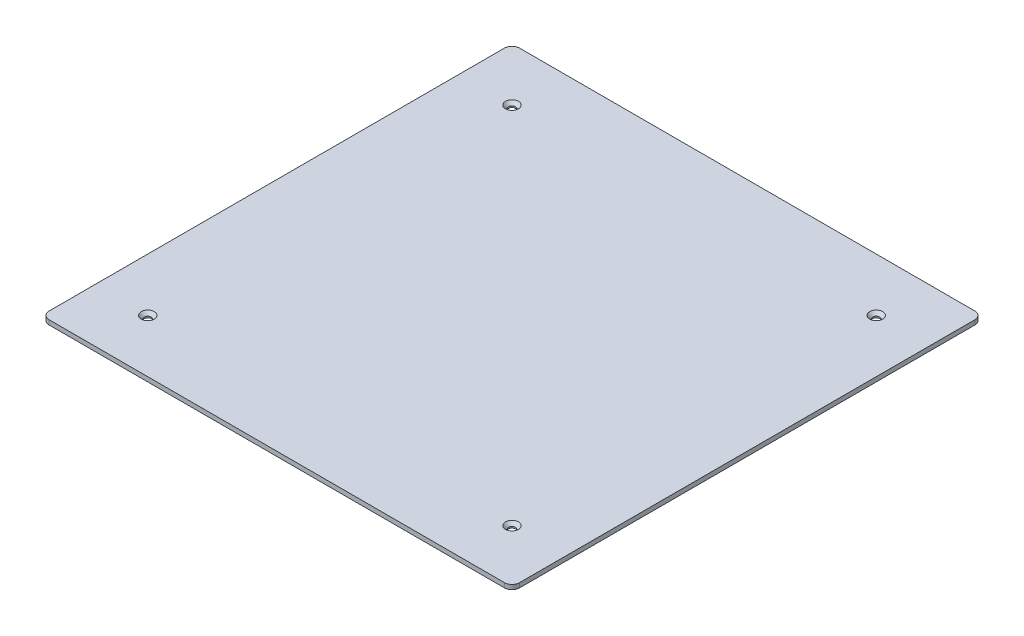
ISO-10303-21;
HEADER;
FILE_DESCRIPTION(('STEP AP214'),'2;1');
FILE_NAME('part.step','',(''),(''),'','','');
FILE_SCHEMA(('AUTOMOTIVE_DESIGN { 1 0 10303 214 1 1 1 1 }'));
ENDSEC;
DATA;
#1=APPLICATION_CONTEXT('core data for automotive mechanical design processes');
#2=APPLICATION_PROTOCOL_DEFINITION('international standard','automotive_design',2000,#1);
#3=PRODUCT_CONTEXT('',#1,'mechanical');
#4=PRODUCT('Part','Part','',(#3));
#5=PRODUCT_RELATED_PRODUCT_CATEGORY('part','',(#4));
#6=PRODUCT_DEFINITION_FORMATION('','',#4);
#7=PRODUCT_DEFINITION_CONTEXT('part definition',#1,'design');
#8=PRODUCT_DEFINITION('design','',#6,#7);
#9=PRODUCT_DEFINITION_SHAPE('','',#8);
#10=(LENGTH_UNIT() NAMED_UNIT(*) SI_UNIT(.MILLI.,.METRE.));
#11=(NAMED_UNIT(*) PLANE_ANGLE_UNIT() SI_UNIT($,.RADIAN.));
#12=(NAMED_UNIT(*) SI_UNIT($,.STERADIAN.) SOLID_ANGLE_UNIT());
#13=UNCERTAINTY_MEASURE_WITH_UNIT(LENGTH_MEASURE(1.E-05),#10,'distance_accuracy_value','');
#14=(GEOMETRIC_REPRESENTATION_CONTEXT(3) GLOBAL_UNCERTAINTY_ASSIGNED_CONTEXT((#13)) GLOBAL_UNIT_ASSIGNED_CONTEXT((#10,
#11,#12)) REPRESENTATION_CONTEXT('',''));
#15=CARTESIAN_POINT('',(0.,0.,0.));
#16=DIRECTION('',(0.,0.,1.));
#17=DIRECTION('',(1.,0.,0.));
#18=AXIS2_PLACEMENT_3D('',#15,#16,#17);
#19=CARTESIAN_POINT('',(-155.,3.,155.));
#20=DIRECTION('',(1.,0.,0.));
#21=DIRECTION('',(0.,0.,-1.));
#22=AXIS2_PLACEMENT_3D('',#19,#20,#21);
#23=PLANE('',#22);
#24=DIRECTION('',(0.,0.,1.));
#25=VECTOR('',#24,1.);
#26=CARTESIAN_POINT('',(-155.,3.,155.));
#27=LINE('',#26,#25);
#28=CARTESIAN_POINT('',(-155.,3.,-150.));
#29=VERTEX_POINT('',#28);
#30=CARTESIAN_POINT('',(-155.,3.,150.));
#31=VERTEX_POINT('',#30);
#32=EDGE_CURVE('E102',#29,#31,#27,.T.);
#33=ORIENTED_EDGE('',*,*,#32,.F.);
#34=DIRECTION('',(0.,-1.,0.));
#35=VECTOR('',#34,1.);
#36=CARTESIAN_POINT('',(-155.,3.,-150.));
#37=LINE('',#36,#35);
#38=CARTESIAN_POINT('',(-155.,0.,-150.));
#39=VERTEX_POINT('',#38);
#40=EDGE_CURVE('E87',#29,#39,#37,.T.);
#41=ORIENTED_EDGE('',*,*,#40,.T.);
#42=DIRECTION('',(0.,0.,1.));
#43=VECTOR('',#42,1.);
#44=CARTESIAN_POINT('',(-155.,0.,155.));
#45=LINE('',#44,#43);
#46=CARTESIAN_POINT('',(-155.,0.,150.));
#47=VERTEX_POINT('',#46);
#48=EDGE_CURVE('E99',#39,#47,#45,.T.);
#49=ORIENTED_EDGE('',*,*,#48,.T.);
#50=DIRECTION('',(0.,-1.,0.));
#51=VECTOR('',#50,1.);
#52=CARTESIAN_POINT('',(-155.,3.,150.));
#53=LINE('',#52,#51);
#54=EDGE_CURVE('E104',#47,#31,#53,.F.);
#55=ORIENTED_EDGE('',*,*,#54,.T.);
#56=EDGE_LOOP('',(#33,#41,#49,#55));
#57=FACE_BOUND('',#56,.T.);
#58=ADVANCED_FACE('F17',(#57),#23,.F.);
#59=CARTESIAN_POINT('',(155.,3.,155.));
#60=DIRECTION('',(0.,0.,-1.));
#61=DIRECTION('',(-1.,0.,0.));
#62=AXIS2_PLACEMENT_3D('',#59,#60,#61);
#63=PLANE('',#62);
#64=DIRECTION('',(1.,0.,0.));
#65=VECTOR('',#64,1.);
#66=CARTESIAN_POINT('',(155.,0.,155.));
#67=LINE('',#66,#65);
#68=CARTESIAN_POINT('',(-150.,0.,155.));
#69=VERTEX_POINT('',#68);
#70=CARTESIAN_POINT('',(150.,0.,155.));
#71=VERTEX_POINT('',#70);
#72=EDGE_CURVE('E108',#69,#71,#67,.T.);
#73=ORIENTED_EDGE('',*,*,#72,.T.);
#74=DIRECTION('',(0.,-1.,0.));
#75=VECTOR('',#74,1.);
#76=CARTESIAN_POINT('',(150.,3.,155.));
#77=LINE('',#76,#75);
#78=CARTESIAN_POINT('',(150.,3.,155.));
#79=VERTEX_POINT('',#78);
#80=EDGE_CURVE('E11',#71,#79,#77,.F.);
#81=ORIENTED_EDGE('',*,*,#80,.T.);
#82=DIRECTION('',(1.,0.,0.));
#83=VECTOR('',#82,1.);
#84=CARTESIAN_POINT('',(155.,3.,155.));
#85=LINE('',#84,#83);
#86=CARTESIAN_POINT('',(-150.,3.,155.));
#87=VERTEX_POINT('',#86);
#88=EDGE_CURVE('E148',#87,#79,#85,.T.);
#89=ORIENTED_EDGE('',*,*,#88,.F.);
#90=DIRECTION('',(0.,-1.,0.));
#91=VECTOR('',#90,1.);
#92=CARTESIAN_POINT('',(-150.,3.,155.));
#93=LINE('',#92,#91);
#94=EDGE_CURVE('E25',#87,#69,#93,.T.);
#95=ORIENTED_EDGE('',*,*,#94,.T.);
#96=EDGE_LOOP('',(#73,#81,#89,#95));
#97=FACE_BOUND('',#96,.T.);
#98=ADVANCED_FACE('F146',(#97),#63,.F.);
#99=CARTESIAN_POINT('',(155.,3.,155.));
#100=DIRECTION('',(-1.,0.,0.));
#101=DIRECTION('',(0.,0.,1.));
#102=AXIS2_PLACEMENT_3D('',#99,#100,#101);
#103=PLANE('',#102);
#104=DIRECTION('',(0.,0.,-1.));
#105=VECTOR('',#104,1.);
#106=CARTESIAN_POINT('',(155.,0.,155.));
#107=LINE('',#106,#105);
#108=CARTESIAN_POINT('',(155.,0.,150.));
#109=VERTEX_POINT('',#108);
#110=CARTESIAN_POINT('',(155.,0.,-150.));
#111=VERTEX_POINT('',#110);
#112=EDGE_CURVE('E112',#109,#111,#107,.T.);
#113=ORIENTED_EDGE('',*,*,#112,.T.);
#114=DIRECTION('',(0.,-1.,0.));
#115=VECTOR('',#114,1.);
#116=CARTESIAN_POINT('',(155.,3.,-150.));
#117=LINE('',#116,#115);
#118=CARTESIAN_POINT('',(155.,3.,-150.));
#119=VERTEX_POINT('',#118);
#120=EDGE_CURVE('E32',#111,#119,#117,.F.);
#121=ORIENTED_EDGE('',*,*,#120,.T.);
#122=DIRECTION('',(0.,0.,-1.));
#123=VECTOR('',#122,1.);
#124=CARTESIAN_POINT('',(155.,3.,155.));
#125=LINE('',#124,#123);
#126=CARTESIAN_POINT('',(155.,3.,150.));
#127=VERTEX_POINT('',#126);
#128=EDGE_CURVE('E156',#127,#119,#125,.T.);
#129=ORIENTED_EDGE('',*,*,#128,.F.);
#130=DIRECTION('',(0.,-1.,0.));
#131=VECTOR('',#130,1.);
#132=CARTESIAN_POINT('',(155.,3.,150.));
#133=LINE('',#132,#131);
#134=EDGE_CURVE('E139',#127,#109,#133,.T.);
#135=ORIENTED_EDGE('',*,*,#134,.T.);
#136=EDGE_LOOP('',(#113,#121,#129,#135));
#137=FACE_BOUND('',#136,.T.);
#138=ADVANCED_FACE('F155',(#137),#103,.F.);
#139=CARTESIAN_POINT('',(155.,3.,-155.));
#140=DIRECTION('',(0.,0.,1.));
#141=DIRECTION('',(1.,0.,0.));
#142=AXIS2_PLACEMENT_3D('',#139,#140,#141);
#143=PLANE('',#142);
#144=DIRECTION('',(-1.,0.,0.));
#145=VECTOR('',#144,1.);
#146=CARTESIAN_POINT('',(155.,0.,-155.));
#147=LINE('',#146,#145);
#148=CARTESIAN_POINT('',(150.,0.,-155.));
#149=VERTEX_POINT('',#148);
#150=CARTESIAN_POINT('',(-150.,0.,-155.));
#151=VERTEX_POINT('',#150);
#152=EDGE_CURVE('E122',#149,#151,#147,.T.);
#153=ORIENTED_EDGE('',*,*,#152,.T.);
#154=DIRECTION('',(0.,-1.,0.));
#155=VECTOR('',#154,1.);
#156=CARTESIAN_POINT('',(-150.,3.,-155.));
#157=LINE('',#156,#155);
#158=CARTESIAN_POINT('',(-150.,3.,-155.));
#159=VERTEX_POINT('',#158);
#160=EDGE_CURVE('E88',#151,#159,#157,.F.);
#161=ORIENTED_EDGE('',*,*,#160,.T.);
#162=DIRECTION('',(-1.,0.,0.));
#163=VECTOR('',#162,1.);
#164=CARTESIAN_POINT('',(155.,3.,-155.));
#165=LINE('',#164,#163);
#166=CARTESIAN_POINT('',(150.,3.,-155.));
#167=VERTEX_POINT('',#166);
#168=EDGE_CURVE('E118',#167,#159,#165,.T.);
#169=ORIENTED_EDGE('',*,*,#168,.F.);
#170=DIRECTION('',(0.,-1.,0.));
#171=VECTOR('',#170,1.);
#172=CARTESIAN_POINT('',(150.,3.,-155.));
#173=LINE('',#172,#171);
#174=EDGE_CURVE('E93',#167,#149,#173,.T.);
#175=ORIENTED_EDGE('',*,*,#174,.T.);
#176=EDGE_LOOP('',(#153,#161,#169,#175));
#177=FACE_BOUND('',#176,.T.);
#178=ADVANCED_FACE('F200',(#177),#143,.F.);
#179=CARTESIAN_POINT('',(0.,3.,0.));
#180=DIRECTION('',(0.,1.,0.));
#181=DIRECTION('',(0.,0.,1.));
#182=AXIS2_PLACEMENT_3D('',#179,#180,#181);
#183=PLANE('',#182);
#184=CARTESIAN_POINT('',(-120.,3.,-120.));
#185=DIRECTION('',(0.,1.,0.));
#186=DIRECTION('',(0.,0.,1.));
#187=AXIS2_PLACEMENT_3D('',#184,#185,#186);
#188=CIRCLE('',#187,4.3);
#189=CARTESIAN_POINT('',(-120.,3.,-115.7));
#190=VERTEX_POINT('',#189);
#191=EDGE_CURVE('E191',#190,#190,#188,.T.);
#192=ORIENTED_EDGE('',*,*,#191,.F.);
#193=EDGE_LOOP('',(#192));
#194=FACE_BOUND('',#193,.T.);
#195=CARTESIAN_POINT('',(120.,3.,-120.));
#196=DIRECTION('',(0.,1.,0.));
#197=DIRECTION('',(0.,0.,1.));
#198=AXIS2_PLACEMENT_3D('',#195,#196,#197);
#199=CIRCLE('',#198,4.3);
#200=CARTESIAN_POINT('',(120.,3.,-115.7));
#201=VERTEX_POINT('',#200);
#202=EDGE_CURVE('E182',#201,#201,#199,.T.);
#203=ORIENTED_EDGE('',*,*,#202,.F.);
#204=EDGE_LOOP('',(#203));
#205=FACE_BOUND('',#204,.T.);
#206=CARTESIAN_POINT('',(-120.,3.,120.));
#207=DIRECTION('',(0.,1.,0.));
#208=DIRECTION('',(0.,0.,1.));
#209=AXIS2_PLACEMENT_3D('',#206,#207,#208);
#210=CIRCLE('',#209,4.3);
#211=CARTESIAN_POINT('',(-120.,3.,124.3));
#212=VERTEX_POINT('',#211);
#213=EDGE_CURVE('E173',#212,#212,#210,.T.);
#214=ORIENTED_EDGE('',*,*,#213,.F.);
#215=EDGE_LOOP('',(#214));
#216=FACE_BOUND('',#215,.T.);
#217=CARTESIAN_POINT('',(120.,3.,120.));
#218=DIRECTION('',(0.,1.,0.));
#219=DIRECTION('',(0.,0.,1.));
#220=AXIS2_PLACEMENT_3D('',#217,#218,#219);
#221=CIRCLE('',#220,4.3);
#222=CARTESIAN_POINT('',(120.,3.,124.3));
#223=VERTEX_POINT('',#222);
#224=EDGE_CURVE('E164',#223,#223,#221,.T.);
#225=ORIENTED_EDGE('',*,*,#224,.F.);
#226=EDGE_LOOP('',(#225));
#227=FACE_BOUND('',#226,.T.);
#228=ORIENTED_EDGE('',*,*,#168,.T.);
#229=CARTESIAN_POINT('',(-150.,3.,-150.));
#230=DIRECTION('',(0.,1.,0.));
#231=DIRECTION('',(0.,0.,1.));
#232=AXIS2_PLACEMENT_3D('',#229,#230,#231);
#233=CIRCLE('',#232,5.);
#234=EDGE_CURVE('E137',#159,#29,#233,.T.);
#235=ORIENTED_EDGE('',*,*,#234,.T.);
#236=ORIENTED_EDGE('',*,*,#32,.T.);
#237=CARTESIAN_POINT('',(-150.,3.,150.));
#238=DIRECTION('',(0.,1.,0.));
#239=DIRECTION('',(0.,0.,1.));
#240=AXIS2_PLACEMENT_3D('',#237,#238,#239);
#241=CIRCLE('',#240,5.);
#242=EDGE_CURVE('E132',#31,#87,#241,.T.);
#243=ORIENTED_EDGE('',*,*,#242,.T.);
#244=ORIENTED_EDGE('',*,*,#88,.T.);
#245=CARTESIAN_POINT('',(150.,3.,150.));
#246=DIRECTION('',(0.,1.,0.));
#247=DIRECTION('',(0.,0.,1.));
#248=AXIS2_PLACEMENT_3D('',#245,#246,#247);
#249=CIRCLE('',#248,5.);
#250=EDGE_CURVE('E39',#79,#127,#249,.T.);
#251=ORIENTED_EDGE('',*,*,#250,.T.);
#252=ORIENTED_EDGE('',*,*,#128,.T.);
#253=CARTESIAN_POINT('',(150.,3.,-150.));
#254=DIRECTION('',(0.,1.,0.));
#255=DIRECTION('',(0.,0.,1.));
#256=AXIS2_PLACEMENT_3D('',#253,#254,#255);
#257=CIRCLE('',#256,5.);
#258=EDGE_CURVE('E135',#119,#167,#257,.T.);
#259=ORIENTED_EDGE('',*,*,#258,.T.);
#260=EDGE_LOOP('',(#228,#235,#236,#243,#244,#251,#252,#259));
#261=FACE_BOUND('',#260,.T.);
#262=ADVANCED_FACE('F197',(#194,#205,#216,#227,#261),#183,.T.);
#263=CARTESIAN_POINT('',(0.,0.,0.));
#264=DIRECTION('',(0.,1.,0.));
#265=DIRECTION('',(0.,0.,1.));
#266=AXIS2_PLACEMENT_3D('',#263,#264,#265);
#267=PLANE('',#266);
#268=CARTESIAN_POINT('',(-120.,0.,-120.));
#269=DIRECTION('',(0.,1.,0.));
#270=DIRECTION('',(0.,0.,1.));
#271=AXIS2_PLACEMENT_3D('',#268,#269,#270);
#272=CIRCLE('',#271,2.25);
#273=CARTESIAN_POINT('',(-120.,0.,-117.75));
#274=VERTEX_POINT('',#273);
#275=EDGE_CURVE('E185',#274,#274,#272,.T.);
#276=ORIENTED_EDGE('',*,*,#275,.T.);
#277=EDGE_LOOP('',(#276));
#278=FACE_BOUND('',#277,.T.);
#279=CARTESIAN_POINT('',(120.,0.,-120.));
#280=DIRECTION('',(0.,1.,0.));
#281=DIRECTION('',(0.,0.,1.));
#282=AXIS2_PLACEMENT_3D('',#279,#280,#281);
#283=CIRCLE('',#282,2.25);
#284=CARTESIAN_POINT('',(120.,0.,-117.75));
#285=VERTEX_POINT('',#284);
#286=EDGE_CURVE('E176',#285,#285,#283,.T.);
#287=ORIENTED_EDGE('',*,*,#286,.T.);
#288=EDGE_LOOP('',(#287));
#289=FACE_BOUND('',#288,.T.);
#290=CARTESIAN_POINT('',(-120.,0.,120.));
#291=DIRECTION('',(0.,1.,0.));
#292=DIRECTION('',(0.,0.,1.));
#293=AXIS2_PLACEMENT_3D('',#290,#291,#292);
#294=CIRCLE('',#293,2.25);
#295=CARTESIAN_POINT('',(-120.,0.,122.25));
#296=VERTEX_POINT('',#295);
#297=EDGE_CURVE('E167',#296,#296,#294,.T.);
#298=ORIENTED_EDGE('',*,*,#297,.T.);
#299=EDGE_LOOP('',(#298));
#300=FACE_BOUND('',#299,.T.);
#301=CARTESIAN_POINT('',(120.,0.,120.));
#302=DIRECTION('',(0.,1.,0.));
#303=DIRECTION('',(0.,0.,1.));
#304=AXIS2_PLACEMENT_3D('',#301,#302,#303);
#305=CIRCLE('',#304,2.25);
#306=CARTESIAN_POINT('',(120.,0.,122.25));
#307=VERTEX_POINT('',#306);
#308=EDGE_CURVE('E109',#307,#307,#305,.T.);
#309=ORIENTED_EDGE('',*,*,#308,.T.);
#310=EDGE_LOOP('',(#309));
#311=FACE_BOUND('',#310,.T.);
#312=ORIENTED_EDGE('',*,*,#48,.F.);
#313=CARTESIAN_POINT('',(-150.,0.,-150.));
#314=DIRECTION('',(0.,1.,0.));
#315=DIRECTION('',(0.,0.,1.));
#316=AXIS2_PLACEMENT_3D('',#313,#314,#315);
#317=CIRCLE('',#316,5.);
#318=EDGE_CURVE('E83',#39,#151,#317,.F.);
#319=ORIENTED_EDGE('',*,*,#318,.T.);
#320=ORIENTED_EDGE('',*,*,#152,.F.);
#321=CARTESIAN_POINT('',(150.,0.,-150.));
#322=DIRECTION('',(0.,1.,0.));
#323=DIRECTION('',(0.,0.,1.));
#324=AXIS2_PLACEMENT_3D('',#321,#322,#323);
#325=CIRCLE('',#324,5.);
#326=EDGE_CURVE('E94',#149,#111,#325,.F.);
#327=ORIENTED_EDGE('',*,*,#326,.T.);
#328=ORIENTED_EDGE('',*,*,#112,.F.);
#329=CARTESIAN_POINT('',(150.,0.,150.));
#330=DIRECTION('',(0.,1.,0.));
#331=DIRECTION('',(0.,0.,1.));
#332=AXIS2_PLACEMENT_3D('',#329,#330,#331);
#333=CIRCLE('',#332,5.);
#334=EDGE_CURVE('E126',#109,#71,#333,.F.);
#335=ORIENTED_EDGE('',*,*,#334,.T.);
#336=ORIENTED_EDGE('',*,*,#72,.F.);
#337=CARTESIAN_POINT('',(-150.,0.,150.));
#338=DIRECTION('',(0.,1.,0.));
#339=DIRECTION('',(0.,0.,1.));
#340=AXIS2_PLACEMENT_3D('',#337,#338,#339);
#341=CIRCLE('',#340,5.);
#342=EDGE_CURVE('E103',#69,#47,#341,.F.);
#343=ORIENTED_EDGE('',*,*,#342,.T.);
#344=EDGE_LOOP('',(#312,#319,#320,#327,#328,#335,#336,#343));
#345=FACE_BOUND('',#344,.T.);
#346=ADVANCED_FACE('F106',(#278,#289,#300,#311,#345),#267,.F.);
#347=CARTESIAN_POINT('',(-150.,3.,-150.));
#348=DIRECTION('',(0.,-1.,0.));
#349=DIRECTION('',(0.,0.,-1.));
#350=AXIS2_PLACEMENT_3D('',#347,#348,#349);
#351=CYLINDRICAL_SURFACE('',#350,5.);
#352=ORIENTED_EDGE('',*,*,#234,.F.);
#353=ORIENTED_EDGE('',*,*,#160,.F.);
#354=ORIENTED_EDGE('',*,*,#318,.F.);
#355=ORIENTED_EDGE('',*,*,#40,.F.);
#356=EDGE_LOOP('',(#352,#353,#354,#355));
#357=FACE_BOUND('',#356,.T.);
#358=ADVANCED_FACE('F86',(#357),#351,.T.);
#359=CARTESIAN_POINT('',(150.,3.,-150.));
#360=DIRECTION('',(0.,-1.,0.));
#361=DIRECTION('',(0.,0.,-1.));
#362=AXIS2_PLACEMENT_3D('',#359,#360,#361);
#363=CYLINDRICAL_SURFACE('',#362,5.);
#364=ORIENTED_EDGE('',*,*,#258,.F.);
#365=ORIENTED_EDGE('',*,*,#120,.F.);
#366=ORIENTED_EDGE('',*,*,#326,.F.);
#367=ORIENTED_EDGE('',*,*,#174,.F.);
#368=EDGE_LOOP('',(#364,#365,#366,#367));
#369=FACE_BOUND('',#368,.T.);
#370=ADVANCED_FACE('F211',(#369),#363,.T.);
#371=CARTESIAN_POINT('',(150.,3.,150.));
#372=DIRECTION('',(0.,-1.,0.));
#373=DIRECTION('',(0.,0.,-1.));
#374=AXIS2_PLACEMENT_3D('',#371,#372,#373);
#375=CYLINDRICAL_SURFACE('',#374,5.);
#376=ORIENTED_EDGE('',*,*,#250,.F.);
#377=ORIENTED_EDGE('',*,*,#80,.F.);
#378=ORIENTED_EDGE('',*,*,#334,.F.);
#379=ORIENTED_EDGE('',*,*,#134,.F.);
#380=EDGE_LOOP('',(#376,#377,#378,#379));
#381=FACE_BOUND('',#380,.T.);
#382=ADVANCED_FACE('F154',(#381),#375,.T.);
#383=CARTESIAN_POINT('',(-150.,3.,150.));
#384=DIRECTION('',(0.,-1.,0.));
#385=DIRECTION('',(0.,0.,-1.));
#386=AXIS2_PLACEMENT_3D('',#383,#384,#385);
#387=CYLINDRICAL_SURFACE('',#386,5.);
#388=ORIENTED_EDGE('',*,*,#242,.F.);
#389=ORIENTED_EDGE('',*,*,#54,.F.);
#390=ORIENTED_EDGE('',*,*,#342,.F.);
#391=ORIENTED_EDGE('',*,*,#94,.F.);
#392=EDGE_LOOP('',(#388,#389,#390,#391));
#393=FACE_BOUND('',#392,.T.);
#394=ADVANCED_FACE('F19',(#393),#387,.T.);
#395=CARTESIAN_POINT('',(120.,3.,120.));
#396=DIRECTION('',(0.,1.,0.));
#397=DIRECTION('',(0.,0.,1.));
#398=AXIS2_PLACEMENT_3D('',#395,#396,#397);
#399=CYLINDRICAL_SURFACE('',#398,2.25);
#400=ORIENTED_EDGE('',*,*,#308,.F.);
#401=EDGE_LOOP('',(#400));
#402=FACE_BOUND('',#401,.T.);
#403=CARTESIAN_POINT('',(120.,0.95,120.));
#404=DIRECTION('',(0.,1.,0.));
#405=DIRECTION('',(0.,0.,1.));
#406=AXIS2_PLACEMENT_3D('',#403,#404,#405);
#407=CIRCLE('',#406,2.25);
#408=CARTESIAN_POINT('',(120.,0.95,122.25));
#409=VERTEX_POINT('',#408);
#410=EDGE_CURVE('E115',#409,#409,#407,.T.);
#411=ORIENTED_EDGE('',*,*,#410,.T.);
#412=EDGE_LOOP('',(#411));
#413=FACE_BOUND('',#412,.T.);
#414=ADVANCED_FACE('F236',(#402,#413),#399,.F.);
#415=CARTESIAN_POINT('',(120.,3.,120.));
#416=DIRECTION('',(0.,1.,0.));
#417=DIRECTION('',(0.,0.,1.));
#418=AXIS2_PLACEMENT_3D('',#415,#416,#417);
#419=CONICAL_SURFACE('',#418,4.3,0.785398163397448);
#420=ORIENTED_EDGE('',*,*,#410,.F.);
#421=EDGE_LOOP('',(#420));
#422=FACE_BOUND('',#421,.T.);
#423=ORIENTED_EDGE('',*,*,#224,.T.);
#424=EDGE_LOOP('',(#423));
#425=FACE_BOUND('',#424,.T.);
#426=ADVANCED_FACE('F239',(#422,#425),#419,.F.);
#427=CARTESIAN_POINT('',(-120.,3.,120.));
#428=DIRECTION('',(0.,1.,0.));
#429=DIRECTION('',(0.,0.,1.));
#430=AXIS2_PLACEMENT_3D('',#427,#428,#429);
#431=CYLINDRICAL_SURFACE('',#430,2.25);
#432=ORIENTED_EDGE('',*,*,#297,.F.);
#433=EDGE_LOOP('',(#432));
#434=FACE_BOUND('',#433,.T.);
#435=CARTESIAN_POINT('',(-120.,0.95,120.));
#436=DIRECTION('',(0.,1.,0.));
#437=DIRECTION('',(0.,0.,1.));
#438=AXIS2_PLACEMENT_3D('',#435,#436,#437);
#439=CIRCLE('',#438,2.25);
#440=CARTESIAN_POINT('',(-120.,0.95,122.25));
#441=VERTEX_POINT('',#440);
#442=EDGE_CURVE('E170',#441,#441,#439,.T.);
#443=ORIENTED_EDGE('',*,*,#442,.T.);
#444=EDGE_LOOP('',(#443));
#445=FACE_BOUND('',#444,.T.);
#446=ADVANCED_FACE('F243',(#434,#445),#431,.F.);
#447=CARTESIAN_POINT('',(-120.,3.,120.));
#448=DIRECTION('',(0.,1.,0.));
#449=DIRECTION('',(0.,0.,1.));
#450=AXIS2_PLACEMENT_3D('',#447,#448,#449);
#451=CONICAL_SURFACE('',#450,4.3,0.785398163397448);
#452=ORIENTED_EDGE('',*,*,#442,.F.);
#453=EDGE_LOOP('',(#452));
#454=FACE_BOUND('',#453,.T.);
#455=ORIENTED_EDGE('',*,*,#213,.T.);
#456=EDGE_LOOP('',(#455));
#457=FACE_BOUND('',#456,.T.);
#458=ADVANCED_FACE('F247',(#454,#457),#451,.F.);
#459=CARTESIAN_POINT('',(120.,3.,-120.));
#460=DIRECTION('',(0.,1.,0.));
#461=DIRECTION('',(0.,0.,1.));
#462=AXIS2_PLACEMENT_3D('',#459,#460,#461);
#463=CYLINDRICAL_SURFACE('',#462,2.25);
#464=ORIENTED_EDGE('',*,*,#286,.F.);
#465=EDGE_LOOP('',(#464));
#466=FACE_BOUND('',#465,.T.);
#467=CARTESIAN_POINT('',(120.,0.95,-120.));
#468=DIRECTION('',(0.,1.,0.));
#469=DIRECTION('',(0.,0.,1.));
#470=AXIS2_PLACEMENT_3D('',#467,#468,#469);
#471=CIRCLE('',#470,2.25);
#472=CARTESIAN_POINT('',(120.,0.95,-117.75));
#473=VERTEX_POINT('',#472);
#474=EDGE_CURVE('E179',#473,#473,#471,.T.);
#475=ORIENTED_EDGE('',*,*,#474,.T.);
#476=EDGE_LOOP('',(#475));
#477=FACE_BOUND('',#476,.T.);
#478=ADVANCED_FACE('F251',(#466,#477),#463,.F.);
#479=CARTESIAN_POINT('',(120.,3.,-120.));
#480=DIRECTION('',(0.,1.,0.));
#481=DIRECTION('',(0.,0.,1.));
#482=AXIS2_PLACEMENT_3D('',#479,#480,#481);
#483=CONICAL_SURFACE('',#482,4.3,0.785398163397448);
#484=ORIENTED_EDGE('',*,*,#474,.F.);
#485=EDGE_LOOP('',(#484));
#486=FACE_BOUND('',#485,.T.);
#487=ORIENTED_EDGE('',*,*,#202,.T.);
#488=EDGE_LOOP('',(#487));
#489=FACE_BOUND('',#488,.T.);
#490=ADVANCED_FACE('F255',(#486,#489),#483,.F.);
#491=CARTESIAN_POINT('',(-120.,3.,-120.));
#492=DIRECTION('',(0.,1.,0.));
#493=DIRECTION('',(0.,0.,1.));
#494=AXIS2_PLACEMENT_3D('',#491,#492,#493);
#495=CYLINDRICAL_SURFACE('',#494,2.25);
#496=ORIENTED_EDGE('',*,*,#275,.F.);
#497=EDGE_LOOP('',(#496));
#498=FACE_BOUND('',#497,.T.);
#499=CARTESIAN_POINT('',(-120.,0.95,-120.));
#500=DIRECTION('',(0.,1.,0.));
#501=DIRECTION('',(0.,0.,1.));
#502=AXIS2_PLACEMENT_3D('',#499,#500,#501);
#503=CIRCLE('',#502,2.25);
#504=CARTESIAN_POINT('',(-120.,0.95,-117.75));
#505=VERTEX_POINT('',#504);
#506=EDGE_CURVE('E188',#505,#505,#503,.T.);
#507=ORIENTED_EDGE('',*,*,#506,.T.);
#508=EDGE_LOOP('',(#507));
#509=FACE_BOUND('',#508,.T.);
#510=ADVANCED_FACE('F259',(#498,#509),#495,.F.);
#511=CARTESIAN_POINT('',(-120.,3.,-120.));
#512=DIRECTION('',(0.,1.,0.));
#513=DIRECTION('',(0.,0.,1.));
#514=AXIS2_PLACEMENT_3D('',#511,#512,#513);
#515=CONICAL_SURFACE('',#514,4.3,0.785398163397448);
#516=ORIENTED_EDGE('',*,*,#506,.F.);
#517=EDGE_LOOP('',(#516));
#518=FACE_BOUND('',#517,.T.);
#519=ORIENTED_EDGE('',*,*,#191,.T.);
#520=EDGE_LOOP('',(#519));
#521=FACE_BOUND('',#520,.T.);
#522=ADVANCED_FACE('F195',(#518,#521),#515,.F.);
#523=CLOSED_SHELL('',(#58,#98,#138,#178,#262,#346,#358,#370,#382,#394,#414,#426,#446,#458,#478,
#490,#510,#522));
#524=MANIFOLD_SOLID_BREP('B1',#523);
#525=ADVANCED_BREP_SHAPE_REPRESENTATION('',(#18,#524),#14);
#526=SHAPE_DEFINITION_REPRESENTATION(#9,#525);
ENDSEC;
END-ISO-10303-21;
